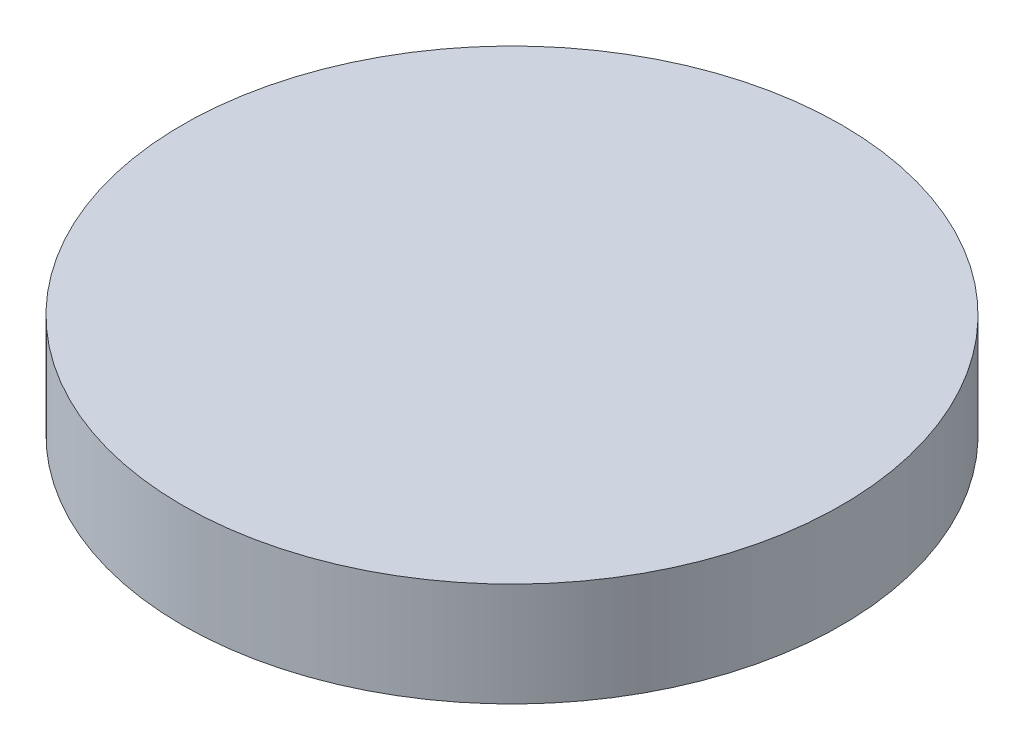
ISO-10303-21;
HEADER;
FILE_DESCRIPTION(('STEP AP214'),'2;1');
FILE_NAME('part.step','',(''),(''),'','','');
FILE_SCHEMA(('AUTOMOTIVE_DESIGN { 1 0 10303 214 1 1 1 1 }'));
ENDSEC;
DATA;
#1=APPLICATION_CONTEXT('core data for automotive mechanical design processes');
#2=APPLICATION_PROTOCOL_DEFINITION('international standard','automotive_design',2000,#1);
#3=PRODUCT_CONTEXT('',#1,'mechanical');
#4=PRODUCT('Part','Part','',(#3));
#5=PRODUCT_RELATED_PRODUCT_CATEGORY('part','',(#4));
#6=PRODUCT_DEFINITION_FORMATION('','',#4);
#7=PRODUCT_DEFINITION_CONTEXT('part definition',#1,'design');
#8=PRODUCT_DEFINITION('design','',#6,#7);
#9=PRODUCT_DEFINITION_SHAPE('','',#8);
#10=(LENGTH_UNIT() NAMED_UNIT(*) SI_UNIT(.MILLI.,.METRE.));
#11=(NAMED_UNIT(*) PLANE_ANGLE_UNIT() SI_UNIT($,.RADIAN.));
#12=(NAMED_UNIT(*) SI_UNIT($,.STERADIAN.) SOLID_ANGLE_UNIT());
#13=UNCERTAINTY_MEASURE_WITH_UNIT(LENGTH_MEASURE(1.E-05),#10,'distance_accuracy_value','');
#14=(GEOMETRIC_REPRESENTATION_CONTEXT(3) GLOBAL_UNCERTAINTY_ASSIGNED_CONTEXT((#13)) GLOBAL_UNIT_ASSIGNED_CONTEXT((#10,
#11,#12)) REPRESENTATION_CONTEXT('',''));
#15=CARTESIAN_POINT('',(0.,0.,0.));
#16=DIRECTION('',(0.,0.,1.));
#17=DIRECTION('',(1.,0.,0.));
#18=AXIS2_PLACEMENT_3D('',#15,#16,#17);
#19=CARTESIAN_POINT('',(0.,2.,0.));
#20=DIRECTION('',(0.,-1.,0.));
#21=DIRECTION('',(0.,0.,-1.));
#22=AXIS2_PLACEMENT_3D('',#19,#20,#21);
#23=CYLINDRICAL_SURFACE('',#22,6.35);
#24=CARTESIAN_POINT('',(0.,2.,0.));
#25=DIRECTION('',(0.,1.,0.));
#26=DIRECTION('',(0.,0.,1.));
#27=AXIS2_PLACEMENT_3D('',#24,#25,#26);
#28=CIRCLE('',#27,6.35);
#29=CARTESIAN_POINT('',(0.,2.,6.35));
#30=VERTEX_POINT('',#29);
#31=EDGE_CURVE('E10',#30,#30,#28,.T.);
#32=ORIENTED_EDGE('',*,*,#31,.F.);
#33=EDGE_LOOP('',(#32));
#34=FACE_BOUND('',#33,.T.);
#35=CARTESIAN_POINT('',(0.,0.,0.));
#36=DIRECTION('',(0.,1.,0.));
#37=DIRECTION('',(0.,0.,1.));
#38=AXIS2_PLACEMENT_3D('',#35,#36,#37);
#39=CIRCLE('',#38,6.35);
#40=CARTESIAN_POINT('',(0.,0.,6.35));
#41=VERTEX_POINT('',#40);
#42=EDGE_CURVE('E36',#41,#41,#39,.T.);
#43=ORIENTED_EDGE('',*,*,#42,.T.);
#44=EDGE_LOOP('',(#43));
#45=FACE_BOUND('',#44,.T.);
#46=ADVANCED_FACE('F33',(#34,#45),#23,.T.);
#47=CARTESIAN_POINT('',(0.,2.,0.));
#48=DIRECTION('',(0.,1.,0.));
#49=DIRECTION('',(0.,0.,1.));
#50=AXIS2_PLACEMENT_3D('',#47,#48,#49);
#51=PLANE('',#50);
#52=ORIENTED_EDGE('',*,*,#31,.T.);
#53=EDGE_LOOP('',(#52));
#54=FACE_BOUND('',#53,.T.);
#55=ADVANCED_FACE('F48',(#54),#51,.T.);
#56=CARTESIAN_POINT('',(0.,0.,0.));
#57=DIRECTION('',(0.,1.,0.));
#58=DIRECTION('',(0.,0.,1.));
#59=AXIS2_PLACEMENT_3D('',#56,#57,#58);
#60=PLANE('',#59);
#61=ORIENTED_EDGE('',*,*,#42,.F.);
#62=EDGE_LOOP('',(#61));
#63=FACE_BOUND('',#62,.T.);
#64=ADVANCED_FACE('F46',(#63),#60,.F.);
#65=CLOSED_SHELL('',(#46,#55,#64));
#66=MANIFOLD_SOLID_BREP('B2',#65);
#67=ADVANCED_BREP_SHAPE_REPRESENTATION('',(#18,#66),#14);
#68=SHAPE_DEFINITION_REPRESENTATION(#9,#67);
ENDSEC;
END-ISO-10303-21;
